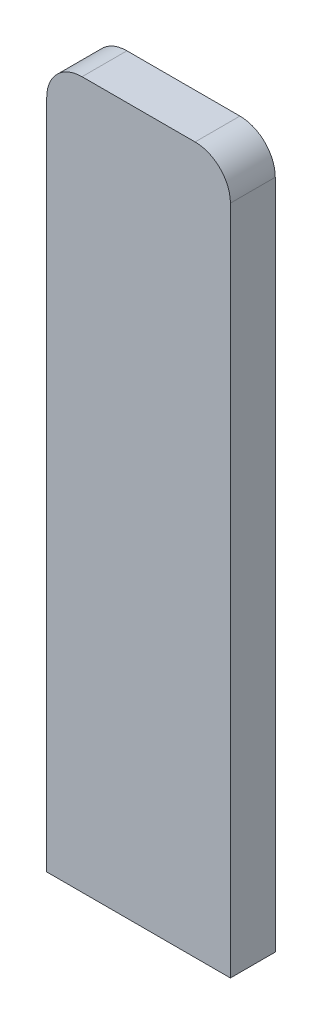
ISO-10303-21;
HEADER;
FILE_DESCRIPTION(('STEP AP214'),'2;1');
FILE_NAME('part.step','',(''),(''),'','','');
FILE_SCHEMA(('AUTOMOTIVE_DESIGN { 1 0 10303 214 1 1 1 1 }'));
ENDSEC;
DATA;
#1=APPLICATION_CONTEXT('core data for automotive mechanical design processes');
#2=APPLICATION_PROTOCOL_DEFINITION('international standard','automotive_design',2000,#1);
#3=PRODUCT_CONTEXT('',#1,'mechanical');
#4=PRODUCT('Part','Part','',(#3));
#5=PRODUCT_RELATED_PRODUCT_CATEGORY('part','',(#4));
#6=PRODUCT_DEFINITION_FORMATION('','',#4);
#7=PRODUCT_DEFINITION_CONTEXT('part definition',#1,'design');
#8=PRODUCT_DEFINITION('design','',#6,#7);
#9=PRODUCT_DEFINITION_SHAPE('','',#8);
#10=(LENGTH_UNIT() NAMED_UNIT(*) SI_UNIT(.MILLI.,.METRE.));
#11=(NAMED_UNIT(*) PLANE_ANGLE_UNIT() SI_UNIT($,.RADIAN.));
#12=(NAMED_UNIT(*) SI_UNIT($,.STERADIAN.) SOLID_ANGLE_UNIT());
#13=UNCERTAINTY_MEASURE_WITH_UNIT(LENGTH_MEASURE(1.E-05),#10,'distance_accuracy_value','');
#14=(GEOMETRIC_REPRESENTATION_CONTEXT(3) GLOBAL_UNCERTAINTY_ASSIGNED_CONTEXT((#13)) GLOBAL_UNIT_ASSIGNED_CONTEXT((#10,
#11,#12)) REPRESENTATION_CONTEXT('',''));
#15=CARTESIAN_POINT('',(0.,0.,0.));
#16=DIRECTION('',(0.,0.,1.));
#17=DIRECTION('',(1.,0.,0.));
#18=AXIS2_PLACEMENT_3D('',#15,#16,#17);
#19=CARTESIAN_POINT('',(-1.32527024895831,-21.2506700204016,0.952957558795939));
#20=DIRECTION('',(-1.,0.,0.));
#21=DIRECTION('',(0.,0.,1.));
#22=AXIS2_PLACEMENT_3D('',#19,#20,#21);
#23=PLANE('',#22);
#24=DIRECTION('',(0.,-1.,0.));
#25=VECTOR('',#24,1.);
#26=CARTESIAN_POINT('',(-1.32527024895831,-21.2506700204016,7.30295755879594));
#27=LINE('',#26,#25);
#28=CARTESIAN_POINT('',(-1.32527024895831,73.7493299795984,7.30295755879594));
#29=VERTEX_POINT('',#28);
#30=CARTESIAN_POINT('',(-1.32527024895831,-21.2506700204016,7.30295755879594));
#31=VERTEX_POINT('',#30);
#32=EDGE_CURVE('E119',#29,#31,#27,.T.);
#33=ORIENTED_EDGE('',*,*,#32,.T.);
#34=DIRECTION('',(0.,0.,1.));
#35=VECTOR('',#34,1.);
#36=CARTESIAN_POINT('',(-1.32527024895831,-21.2506700204016,0.952957558795939));
#37=LINE('',#36,#35);
#38=CARTESIAN_POINT('',(-1.32527024895831,-21.2506700204016,0.952957558795939));
#39=VERTEX_POINT('',#38);
#40=EDGE_CURVE('E11',#39,#31,#37,.T.);
#41=ORIENTED_EDGE('',*,*,#40,.F.);
#42=DIRECTION('',(0.,-1.,0.));
#43=VECTOR('',#42,1.);
#44=CARTESIAN_POINT('',(-1.32527024895831,-21.2506700204016,0.952957558795939));
#45=LINE('',#44,#43);
#46=CARTESIAN_POINT('',(-1.32527024895831,73.7493299795984,0.952957558795939));
#47=VERTEX_POINT('',#46);
#48=EDGE_CURVE('E129',#47,#39,#45,.T.);
#49=ORIENTED_EDGE('',*,*,#48,.F.);
#50=DIRECTION('',(0.,0.,1.));
#51=VECTOR('',#50,1.);
#52=CARTESIAN_POINT('',(-1.32527024895831,73.7493299795984,0.952957558795939));
#53=LINE('',#52,#51);
#54=EDGE_CURVE('E115',#47,#29,#53,.T.);
#55=ORIENTED_EDGE('',*,*,#54,.T.);
#56=EDGE_LOOP('',(#33,#41,#49,#55));
#57=FACE_BOUND('',#56,.T.);
#58=ADVANCED_FACE('F35',(#57),#23,.F.);
#59=CARTESIAN_POINT('',(-1.32527024895831,-21.2506700204016,0.952957558795939));
#60=DIRECTION('',(0.,1.,0.));
#61=DIRECTION('',(0.,0.,1.));
#62=AXIS2_PLACEMENT_3D('',#59,#60,#61);
#63=PLANE('',#62);
#64=DIRECTION('',(-1.,0.,0.));
#65=VECTOR('',#64,1.);
#66=CARTESIAN_POINT('',(-1.32527024895831,-21.2506700204016,7.30295755879594));
#67=LINE('',#66,#65);
#68=CARTESIAN_POINT('',(-27.3252702489583,-21.2506700204016,7.30295755879594));
#69=VERTEX_POINT('',#68);
#70=EDGE_CURVE('E122',#31,#69,#67,.T.);
#71=ORIENTED_EDGE('',*,*,#70,.T.);
#72=DIRECTION('',(0.,0.,1.));
#73=VECTOR('',#72,1.);
#74=CARTESIAN_POINT('',(-27.3252702489583,-21.2506700204016,0.952957558795939));
#75=LINE('',#74,#73);
#76=CARTESIAN_POINT('',(-27.3252702489583,-21.2506700204016,0.952957558795939));
#77=VERTEX_POINT('',#76);
#78=EDGE_CURVE('E43',#77,#69,#75,.T.);
#79=ORIENTED_EDGE('',*,*,#78,.F.);
#80=DIRECTION('',(-1.,0.,0.));
#81=VECTOR('',#80,1.);
#82=CARTESIAN_POINT('',(-1.32527024895831,-21.2506700204016,0.952957558795939));
#83=LINE('',#82,#81);
#84=EDGE_CURVE('E88',#39,#77,#83,.T.);
#85=ORIENTED_EDGE('',*,*,#84,.F.);
#86=ORIENTED_EDGE('',*,*,#40,.T.);
#87=EDGE_LOOP('',(#71,#79,#85,#86));
#88=FACE_BOUND('',#87,.T.);
#89=ADVANCED_FACE('F153',(#88),#63,.F.);
#90=CARTESIAN_POINT('',(-27.3252702489583,-21.2506700204016,0.952957558795939));
#91=DIRECTION('',(1.,0.,0.));
#92=DIRECTION('',(0.,0.,-1.));
#93=AXIS2_PLACEMENT_3D('',#90,#91,#92);
#94=PLANE('',#93);
#95=DIRECTION('',(0.,1.,0.));
#96=VECTOR('',#95,1.);
#97=CARTESIAN_POINT('',(-27.3252702489583,-21.2506700204016,7.30295755879594));
#98=LINE('',#97,#96);
#99=CARTESIAN_POINT('',(-27.3252702489583,73.7493299795984,7.30295755879594));
#100=VERTEX_POINT('',#99);
#101=EDGE_CURVE('E124',#69,#100,#98,.T.);
#102=ORIENTED_EDGE('',*,*,#101,.T.);
#103=DIRECTION('',(0.,0.,1.));
#104=VECTOR('',#103,1.);
#105=CARTESIAN_POINT('',(-27.3252702489583,73.7493299795984,0.952957558795939));
#106=LINE('',#105,#104);
#107=CARTESIAN_POINT('',(-27.3252702489583,73.7493299795984,0.952957558795939));
#108=VERTEX_POINT('',#107);
#109=EDGE_CURVE('E110',#108,#100,#106,.T.);
#110=ORIENTED_EDGE('',*,*,#109,.F.);
#111=DIRECTION('',(0.,1.,0.));
#112=VECTOR('',#111,1.);
#113=CARTESIAN_POINT('',(-27.3252702489583,-21.2506700204016,0.952957558795939));
#114=LINE('',#113,#112);
#115=EDGE_CURVE('E101',#77,#108,#114,.T.);
#116=ORIENTED_EDGE('',*,*,#115,.F.);
#117=ORIENTED_EDGE('',*,*,#78,.T.);
#118=EDGE_LOOP('',(#102,#110,#116,#117));
#119=FACE_BOUND('',#118,.T.);
#120=ADVANCED_FACE('F135',(#119),#94,.F.);
#121=CARTESIAN_POINT('',(-22.3252702489583,73.7493299795984,0.952957558795939));
#122=DIRECTION('',(0.,0.,1.));
#123=DIRECTION('',(1.,0.,0.));
#124=AXIS2_PLACEMENT_3D('',#121,#122,#123);
#125=CYLINDRICAL_SURFACE('',#124,5.);
#126=CARTESIAN_POINT('',(-22.3252702489583,73.7493299795984,7.30295755879594));
#127=DIRECTION('',(0.,0.,-1.));
#128=DIRECTION('',(1.,0.,0.));
#129=AXIS2_PLACEMENT_3D('',#126,#127,#128);
#130=CIRCLE('',#129,5.);
#131=CARTESIAN_POINT('',(-22.3252702489583,78.7493299795984,7.30295755879594));
#132=VERTEX_POINT('',#131);
#133=EDGE_CURVE('E109',#100,#132,#130,.T.);
#134=ORIENTED_EDGE('',*,*,#133,.T.);
#135=DIRECTION('',(0.,0.,1.));
#136=VECTOR('',#135,1.);
#137=CARTESIAN_POINT('',(-22.3252702489583,78.7493299795984,0.952957558795939));
#138=LINE('',#137,#136);
#139=CARTESIAN_POINT('',(-22.3252702489583,78.7493299795984,0.952957558795939));
#140=VERTEX_POINT('',#139);
#141=EDGE_CURVE('E106',#140,#132,#138,.T.);
#142=ORIENTED_EDGE('',*,*,#141,.F.);
#143=CARTESIAN_POINT('',(-22.3252702489583,73.7493299795984,0.952957558795939));
#144=DIRECTION('',(0.,0.,-1.));
#145=DIRECTION('',(1.,0.,0.));
#146=AXIS2_PLACEMENT_3D('',#143,#144,#145);
#147=CIRCLE('',#146,5.);
#148=EDGE_CURVE('E95',#108,#140,#147,.T.);
#149=ORIENTED_EDGE('',*,*,#148,.F.);
#150=ORIENTED_EDGE('',*,*,#109,.T.);
#151=EDGE_LOOP('',(#134,#142,#149,#150));
#152=FACE_BOUND('',#151,.T.);
#153=ADVANCED_FACE('F107',(#152),#125,.T.);
#154=CARTESIAN_POINT('',(-6.32527024895834,78.7493299795984,0.952957558795939));
#155=DIRECTION('',(0.,-1.,0.));
#156=DIRECTION('',(0.,0.,-1.));
#157=AXIS2_PLACEMENT_3D('',#154,#155,#156);
#158=PLANE('',#157);
#159=DIRECTION('',(1.,0.,0.));
#160=VECTOR('',#159,1.);
#161=CARTESIAN_POINT('',(-6.32527024895834,78.7493299795984,7.30295755879594));
#162=LINE('',#161,#160);
#163=CARTESIAN_POINT('',(-6.32527024895834,78.7493299795984,7.30295755879594));
#164=VERTEX_POINT('',#163);
#165=EDGE_CURVE('E74',#132,#164,#162,.T.);
#166=ORIENTED_EDGE('',*,*,#165,.T.);
#167=DIRECTION('',(0.,0.,1.));
#168=VECTOR('',#167,1.);
#169=CARTESIAN_POINT('',(-6.32527024895834,78.7493299795984,0.952957558795939));
#170=LINE('',#169,#168);
#171=CARTESIAN_POINT('',(-6.32527024895834,78.7493299795984,0.952957558795939));
#172=VERTEX_POINT('',#171);
#173=EDGE_CURVE('E111',#172,#164,#170,.T.);
#174=ORIENTED_EDGE('',*,*,#173,.F.);
#175=DIRECTION('',(1.,0.,0.));
#176=VECTOR('',#175,1.);
#177=CARTESIAN_POINT('',(-6.32527024895834,78.7493299795984,0.952957558795939));
#178=LINE('',#177,#176);
#179=EDGE_CURVE('E99',#140,#172,#178,.T.);
#180=ORIENTED_EDGE('',*,*,#179,.F.);
#181=ORIENTED_EDGE('',*,*,#141,.T.);
#182=EDGE_LOOP('',(#166,#174,#180,#181));
#183=FACE_BOUND('',#182,.T.);
#184=ADVANCED_FACE('F113',(#183),#158,.F.);
#185=CARTESIAN_POINT('',(-6.32527024895831,73.7493299795984,0.952957558795939));
#186=DIRECTION('',(0.,0.,1.));
#187=DIRECTION('',(1.,0.,0.));
#188=AXIS2_PLACEMENT_3D('',#185,#186,#187);
#189=CYLINDRICAL_SURFACE('',#188,5.);
#190=CARTESIAN_POINT('',(-6.32527024895831,73.7493299795984,7.30295755879594));
#191=DIRECTION('',(0.,0.,-1.));
#192=DIRECTION('',(1.,0.,0.));
#193=AXIS2_PLACEMENT_3D('',#190,#191,#192);
#194=CIRCLE('',#193,5.);
#195=EDGE_CURVE('E80',#164,#29,#194,.T.);
#196=ORIENTED_EDGE('',*,*,#195,.T.);
#197=ORIENTED_EDGE('',*,*,#54,.F.);
#198=CARTESIAN_POINT('',(-6.32527024895831,73.7493299795984,0.952957558795939));
#199=DIRECTION('',(0.,0.,-1.));
#200=DIRECTION('',(1.,0.,0.));
#201=AXIS2_PLACEMENT_3D('',#198,#199,#200);
#202=CIRCLE('',#201,5.);
#203=EDGE_CURVE('E51',#172,#47,#202,.T.);
#204=ORIENTED_EDGE('',*,*,#203,.F.);
#205=ORIENTED_EDGE('',*,*,#173,.T.);
#206=EDGE_LOOP('',(#196,#197,#204,#205));
#207=FACE_BOUND('',#206,.T.);
#208=ADVANCED_FACE('F142',(#207),#189,.T.);
#209=CARTESIAN_POINT('',(-6.32527024895831,73.7493299795984,0.952957558795939));
#210=DIRECTION('',(0.,0.,1.));
#211=DIRECTION('',(1.,0.,0.));
#212=AXIS2_PLACEMENT_3D('',#209,#210,#211);
#213=PLANE('',#212);
#214=ORIENTED_EDGE('',*,*,#48,.T.);
#215=ORIENTED_EDGE('',*,*,#84,.T.);
#216=ORIENTED_EDGE('',*,*,#115,.T.);
#217=ORIENTED_EDGE('',*,*,#148,.T.);
#218=ORIENTED_EDGE('',*,*,#179,.T.);
#219=ORIENTED_EDGE('',*,*,#203,.T.);
#220=EDGE_LOOP('',(#214,#215,#216,#217,#218,#219));
#221=FACE_BOUND('',#220,.T.);
#222=ADVANCED_FACE('F97',(#221),#213,.F.);
#223=CARTESIAN_POINT('',(-6.32527024895831,73.7493299795984,7.30295755879594));
#224=DIRECTION('',(0.,0.,1.));
#225=DIRECTION('',(1.,0.,0.));
#226=AXIS2_PLACEMENT_3D('',#223,#224,#225);
#227=PLANE('',#226);
#228=ORIENTED_EDGE('',*,*,#32,.F.);
#229=ORIENTED_EDGE('',*,*,#195,.F.);
#230=ORIENTED_EDGE('',*,*,#165,.F.);
#231=ORIENTED_EDGE('',*,*,#133,.F.);
#232=ORIENTED_EDGE('',*,*,#101,.F.);
#233=ORIENTED_EDGE('',*,*,#70,.F.);
#234=EDGE_LOOP('',(#228,#229,#230,#231,#232,#233));
#235=FACE_BOUND('',#234,.T.);
#236=ADVANCED_FACE('F138',(#235),#227,.T.);
#237=CLOSED_SHELL('',(#58,#89,#120,#153,#184,#208,#222,#236));
#238=MANIFOLD_SOLID_BREP('B2',#237);
#239=ADVANCED_BREP_SHAPE_REPRESENTATION('',(#18,#238),#14);
#240=SHAPE_DEFINITION_REPRESENTATION(#9,#239);
ENDSEC;
END-ISO-10303-21;
